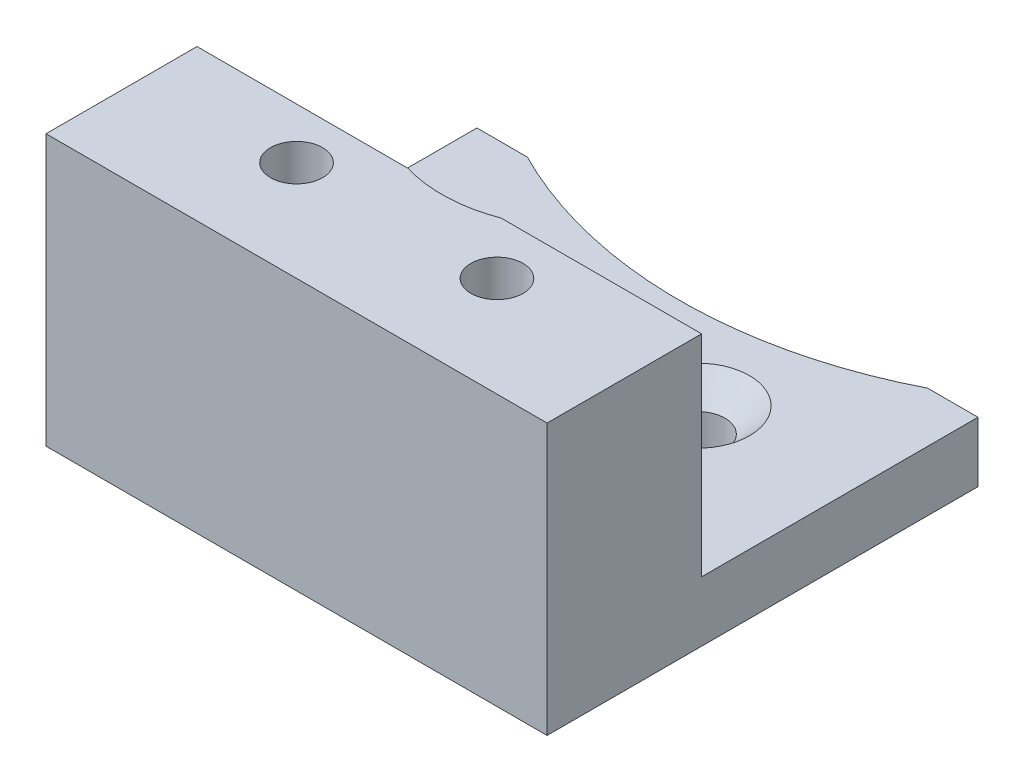
ISO-10303-21;
HEADER;
FILE_DESCRIPTION(('STEP AP214'),'2;1');
FILE_NAME('part.step','',(''),(''),'','','');
FILE_SCHEMA(('AUTOMOTIVE_DESIGN { 1 0 10303 214 1 1 1 1 }'));
ENDSEC;
DATA;
#1=APPLICATION_CONTEXT('core data for automotive mechanical design processes');
#2=APPLICATION_PROTOCOL_DEFINITION('international standard','automotive_design',2000,#1);
#3=PRODUCT_CONTEXT('',#1,'mechanical');
#4=PRODUCT('Part','Part','',(#3));
#5=PRODUCT_RELATED_PRODUCT_CATEGORY('part','',(#4));
#6=PRODUCT_DEFINITION_FORMATION('','',#4);
#7=PRODUCT_DEFINITION_CONTEXT('part definition',#1,'design');
#8=PRODUCT_DEFINITION('design','',#6,#7);
#9=PRODUCT_DEFINITION_SHAPE('','',#8);
#10=(LENGTH_UNIT() NAMED_UNIT(*) SI_UNIT(.MILLI.,.METRE.));
#11=(NAMED_UNIT(*) PLANE_ANGLE_UNIT() SI_UNIT($,.RADIAN.));
#12=(NAMED_UNIT(*) SI_UNIT($,.STERADIAN.) SOLID_ANGLE_UNIT());
#13=UNCERTAINTY_MEASURE_WITH_UNIT(LENGTH_MEASURE(1.E-05),#10,'distance_accuracy_value','');
#14=(GEOMETRIC_REPRESENTATION_CONTEXT(3) GLOBAL_UNCERTAINTY_ASSIGNED_CONTEXT((#13)) GLOBAL_UNIT_ASSIGNED_CONTEXT((#10,
#11,#12)) REPRESENTATION_CONTEXT('',''));
#15=CARTESIAN_POINT('',(0.,0.,0.));
#16=DIRECTION('',(0.,0.,1.));
#17=DIRECTION('',(1.,0.,0.));
#18=AXIS2_PLACEMENT_3D('',#15,#16,#17);
#19=CARTESIAN_POINT('',(0.,6.,0.));
#20=DIRECTION('',(0.,1.,0.));
#21=DIRECTION('',(0.,0.,1.));
#22=AXIS2_PLACEMENT_3D('',#19,#20,#21);
#23=PLANE('',#22);
#24=CARTESIAN_POINT('',(25.,6.,17.5));
#25=DIRECTION('',(0.,1.,0.));
#26=DIRECTION('',(0.,0.,1.));
#27=AXIS2_PLACEMENT_3D('',#24,#25,#26);
#28=CIRCLE('',#27,3.25);
#29=CARTESIAN_POINT('',(25.,6.,20.75));
#30=VERTEX_POINT('',#29);
#31=EDGE_CURVE('E189',#30,#30,#28,.T.);
#32=ORIENTED_EDGE('',*,*,#31,.F.);
#33=EDGE_LOOP('',(#32));
#34=FACE_BOUND('',#33,.T.);
#35=CARTESIAN_POINT('',(35.,6.,16.));
#36=DIRECTION('',(0.,1.,0.));
#37=DIRECTION('',(0.,0.,1.));
#38=AXIS2_PLACEMENT_3D('',#35,#36,#37);
#39=CIRCLE('',#38,5.2);
#40=CARTESIAN_POINT('',(35.,6.,21.2));
#41=VERTEX_POINT('',#40);
#42=EDGE_CURVE('E178',#41,#41,#39,.T.);
#43=ORIENTED_EDGE('',*,*,#42,.F.);
#44=EDGE_LOOP('',(#43));
#45=FACE_BOUND('',#44,.T.);
#46=CARTESIAN_POINT('',(15.,6.,16.));
#47=DIRECTION('',(0.,1.,0.));
#48=DIRECTION('',(0.,0.,1.));
#49=AXIS2_PLACEMENT_3D('',#46,#47,#48);
#50=CIRCLE('',#49,5.2);
#51=CARTESIAN_POINT('',(15.,6.,21.2));
#52=VERTEX_POINT('',#51);
#53=EDGE_CURVE('E169',#52,#52,#50,.T.);
#54=ORIENTED_EDGE('',*,*,#53,.F.);
#55=EDGE_LOOP('',(#54));
#56=FACE_BOUND('',#55,.T.);
#57=CARTESIAN_POINT('',(25.,6.,17.5));
#58=DIRECTION('',(0.,-1.,0.));
#59=DIRECTION('',(0.,0.,1.));
#60=AXIS2_PLACEMENT_3D('',#57,#58,#59);
#61=CIRCLE('',#60,14.);
#62=CARTESIAN_POINT('',(29.9890512919729,6.,30.5808779218393));
#63=VERTEX_POINT('',#62);
#64=CARTESIAN_POINT('',(21.0399484474264,6.,30.9282534866214));
#65=VERTEX_POINT('',#64);
#66=EDGE_CURVE('E146',#63,#65,#61,.T.);
#67=ORIENTED_EDGE('',*,*,#66,.F.);
#68=DIRECTION('',(-1.,0.,0.));
#69=VECTOR('',#68,1.);
#70=CARTESIAN_POINT('',(50.,6.,30.5808779218393));
#71=LINE('',#70,#69);
#72=CARTESIAN_POINT('',(50.,6.,30.5808779218393));
#73=VERTEX_POINT('',#72);
#74=EDGE_CURVE('E159',#73,#63,#71,.T.);
#75=ORIENTED_EDGE('',*,*,#74,.F.);
#76=DIRECTION('',(0.,0.,1.));
#77=VECTOR('',#76,1.);
#78=CARTESIAN_POINT('',(50.,6.,0.));
#79=LINE('',#78,#77);
#80=CARTESIAN_POINT('',(50.,6.,3.));
#81=VERTEX_POINT('',#80);
#82=EDGE_CURVE('E206',#81,#73,#79,.T.);
#83=ORIENTED_EDGE('',*,*,#82,.F.);
#84=DIRECTION('',(1.,0.,0.));
#85=VECTOR('',#84,1.);
#86=CARTESIAN_POINT('',(0.,6.,3.00000000000003));
#87=LINE('',#86,#85);
#88=CARTESIAN_POINT('',(44.9688155912468,6.,3.));
#89=VERTEX_POINT('',#88);
#90=EDGE_CURVE('E209',#89,#81,#87,.T.);
#91=ORIENTED_EDGE('',*,*,#90,.F.);
#92=CARTESIAN_POINT('',(25.,6.,-36.2077339804633));
#93=DIRECTION('',(0.,1.,0.));
#94=DIRECTION('',(0.,0.,1.));
#95=AXIS2_PLACEMENT_3D('',#92,#93,#94);
#96=CIRCLE('',#95,44.);
#97=CARTESIAN_POINT('',(5.03118440875324,6.,3.));
#98=VERTEX_POINT('',#97);
#99=EDGE_CURVE('E197',#98,#89,#96,.T.);
#100=ORIENTED_EDGE('',*,*,#99,.F.);
#101=DIRECTION('',(1.,0.,0.));
#102=VECTOR('',#101,1.);
#103=CARTESIAN_POINT('',(0.,6.,3.));
#104=LINE('',#103,#102);
#105=CARTESIAN_POINT('',(0.,6.,3.));
#106=VERTEX_POINT('',#105);
#107=EDGE_CURVE('E199',#106,#98,#104,.T.);
#108=ORIENTED_EDGE('',*,*,#107,.F.);
#109=DIRECTION('',(0.,0.,1.));
#110=VECTOR('',#109,1.);
#111=CARTESIAN_POINT('',(0.,6.,0.));
#112=LINE('',#111,#110);
#113=CARTESIAN_POINT('',(0.,6.,30.9282534866214));
#114=VERTEX_POINT('',#113);
#115=EDGE_CURVE('E203',#106,#114,#112,.T.);
#116=ORIENTED_EDGE('',*,*,#115,.T.);
#117=DIRECTION('',(-1.,0.,0.));
#118=VECTOR('',#117,1.);
#119=CARTESIAN_POINT('',(21.0399484474264,6.,30.9282534866214));
#120=LINE('',#119,#118);
#121=EDGE_CURVE('E144',#65,#114,#120,.T.);
#122=ORIENTED_EDGE('',*,*,#121,.F.);
#123=EDGE_LOOP('',(#67,#75,#83,#91,#100,#108,#116,#122));
#124=FACE_BOUND('',#123,.T.);
#125=ADVANCED_FACE('F35',(#34,#45,#56,#124),#23,.T.);
#126=CARTESIAN_POINT('',(25.,6.,-36.2077339804633));
#127=DIRECTION('',(0.,-1.,0.));
#128=DIRECTION('',(0.,0.,-1.));
#129=AXIS2_PLACEMENT_3D('',#126,#127,#128);
#130=CYLINDRICAL_SURFACE('',#129,44.);
#131=CARTESIAN_POINT('',(25.,0.,-36.2077339804633));
#132=DIRECTION('',(0.,1.,0.));
#133=DIRECTION('',(0.,0.,1.));
#134=AXIS2_PLACEMENT_3D('',#131,#132,#133);
#135=CIRCLE('',#134,44.);
#136=CARTESIAN_POINT('',(5.03118440875324,0.,3.));
#137=VERTEX_POINT('',#136);
#138=CARTESIAN_POINT('',(44.9688155912468,0.,3.));
#139=VERTEX_POINT('',#138);
#140=EDGE_CURVE('E194',#137,#139,#135,.T.);
#141=ORIENTED_EDGE('',*,*,#140,.F.);
#142=DIRECTION('',(0.,-1.,0.));
#143=VECTOR('',#142,1.);
#144=CARTESIAN_POINT('',(5.03118440875324,6.,3.));
#145=LINE('',#144,#143);
#146=EDGE_CURVE('E39',#98,#137,#145,.T.);
#147=ORIENTED_EDGE('',*,*,#146,.F.);
#148=ORIENTED_EDGE('',*,*,#99,.T.);
#149=DIRECTION('',(0.,-1.,0.));
#150=VECTOR('',#149,1.);
#151=CARTESIAN_POINT('',(44.9688155912468,6.,3.));
#152=LINE('',#151,#150);
#153=EDGE_CURVE('E60',#89,#139,#152,.T.);
#154=ORIENTED_EDGE('',*,*,#153,.T.);
#155=EDGE_LOOP('',(#141,#147,#148,#154));
#156=FACE_BOUND('',#155,.T.);
#157=ADVANCED_FACE('F37',(#156),#130,.F.);
#158=CARTESIAN_POINT('',(0.,6.,3.));
#159=DIRECTION('',(0.,0.,-1.));
#160=DIRECTION('',(-1.,0.,0.));
#161=AXIS2_PLACEMENT_3D('',#158,#159,#160);
#162=PLANE('',#161);
#163=DIRECTION('',(1.,0.,0.));
#164=VECTOR('',#163,1.);
#165=CARTESIAN_POINT('',(0.,0.,3.));
#166=LINE('',#165,#164);
#167=CARTESIAN_POINT('',(0.,0.,3.));
#168=VERTEX_POINT('',#167);
#169=EDGE_CURVE('E212',#168,#137,#166,.T.);
#170=ORIENTED_EDGE('',*,*,#169,.F.);
#171=DIRECTION('',(0.,-1.,0.));
#172=VECTOR('',#171,1.);
#173=CARTESIAN_POINT('',(0.,6.,3.));
#174=LINE('',#173,#172);
#175=EDGE_CURVE('E130',#106,#168,#174,.T.);
#176=ORIENTED_EDGE('',*,*,#175,.F.);
#177=ORIENTED_EDGE('',*,*,#107,.T.);
#178=ORIENTED_EDGE('',*,*,#146,.T.);
#179=EDGE_LOOP('',(#170,#176,#177,#178));
#180=FACE_BOUND('',#179,.T.);
#181=ADVANCED_FACE('F235',(#180),#162,.T.);
#182=CARTESIAN_POINT('',(0.,6.,0.));
#183=DIRECTION('',(1.,0.,0.));
#184=DIRECTION('',(0.,0.,-1.));
#185=AXIS2_PLACEMENT_3D('',#182,#183,#184);
#186=PLANE('',#185);
#187=DIRECTION('',(0.,0.,1.));
#188=VECTOR('',#187,1.);
#189=CARTESIAN_POINT('',(0.,0.,0.));
#190=LINE('',#189,#188);
#191=CARTESIAN_POINT('',(0.,0.,46.));
#192=VERTEX_POINT('',#191);
#193=EDGE_CURVE('E126',#168,#192,#190,.T.);
#194=ORIENTED_EDGE('',*,*,#193,.T.);
#195=DIRECTION('',(0.,-1.,0.));
#196=VECTOR('',#195,1.);
#197=CARTESIAN_POINT('',(0.,6.,46.));
#198=LINE('',#197,#196);
#199=CARTESIAN_POINT('',(0.,27.,46.));
#200=VERTEX_POINT('',#199);
#201=EDGE_CURVE('E119',#200,#192,#198,.T.);
#202=ORIENTED_EDGE('',*,*,#201,.F.);
#203=DIRECTION('',(0.,0.,1.));
#204=VECTOR('',#203,1.);
#205=CARTESIAN_POINT('',(0.,27.,30.9282534866214));
#206=LINE('',#205,#204);
#207=CARTESIAN_POINT('',(0.,27.,30.9282534866214));
#208=VERTEX_POINT('',#207);
#209=EDGE_CURVE('E124',#208,#200,#206,.T.);
#210=ORIENTED_EDGE('',*,*,#209,.F.);
#211=DIRECTION('',(0.,-1.,0.));
#212=VECTOR('',#211,1.);
#213=CARTESIAN_POINT('',(0.,27.,30.9282534866214));
#214=LINE('',#213,#212);
#215=EDGE_CURVE('E158',#208,#114,#214,.T.);
#216=ORIENTED_EDGE('',*,*,#215,.T.);
#217=ORIENTED_EDGE('',*,*,#115,.F.);
#218=ORIENTED_EDGE('',*,*,#175,.T.);
#219=EDGE_LOOP('',(#194,#202,#210,#216,#217,#218));
#220=FACE_BOUND('',#219,.T.);
#221=ADVANCED_FACE('F121',(#220),#186,.F.);
#222=CARTESIAN_POINT('',(0.,6.,46.));
#223=DIRECTION('',(0.,0.,-1.));
#224=DIRECTION('',(-1.,0.,0.));
#225=AXIS2_PLACEMENT_3D('',#222,#223,#224);
#226=PLANE('',#225);
#227=DIRECTION('',(1.,0.,0.));
#228=VECTOR('',#227,1.);
#229=CARTESIAN_POINT('',(0.,0.,46.));
#230=LINE('',#229,#228);
#231=CARTESIAN_POINT('',(50.,0.,46.));
#232=VERTEX_POINT('',#231);
#233=EDGE_CURVE('E216',#192,#232,#230,.T.);
#234=ORIENTED_EDGE('',*,*,#233,.T.);
#235=DIRECTION('',(0.,-1.,0.));
#236=VECTOR('',#235,1.);
#237=CARTESIAN_POINT('',(50.,6.,46.));
#238=LINE('',#237,#236);
#239=CARTESIAN_POINT('',(50.,27.,46.));
#240=VERTEX_POINT('',#239);
#241=EDGE_CURVE('E131',#240,#232,#238,.T.);
#242=ORIENTED_EDGE('',*,*,#241,.F.);
#243=DIRECTION('',(1.,0.,0.));
#244=VECTOR('',#243,1.);
#245=CARTESIAN_POINT('',(0.,27.,46.));
#246=LINE('',#245,#244);
#247=EDGE_CURVE('E134',#200,#240,#246,.T.);
#248=ORIENTED_EDGE('',*,*,#247,.F.);
#249=ORIENTED_EDGE('',*,*,#201,.T.);
#250=EDGE_LOOP('',(#234,#242,#248,#249));
#251=FACE_BOUND('',#250,.T.);
#252=ADVANCED_FACE('F135',(#251),#226,.F.);
#253=CARTESIAN_POINT('',(50.,6.,0.));
#254=DIRECTION('',(1.,0.,0.));
#255=DIRECTION('',(0.,0.,-1.));
#256=AXIS2_PLACEMENT_3D('',#253,#254,#255);
#257=PLANE('',#256);
#258=DIRECTION('',(0.,0.,1.));
#259=VECTOR('',#258,1.);
#260=CARTESIAN_POINT('',(50.,0.,0.));
#261=LINE('',#260,#259);
#262=CARTESIAN_POINT('',(50.,0.,3.));
#263=VERTEX_POINT('',#262);
#264=EDGE_CURVE('E218',#263,#232,#261,.T.);
#265=ORIENTED_EDGE('',*,*,#264,.F.);
#266=DIRECTION('',(0.,-1.,0.));
#267=VECTOR('',#266,1.);
#268=CARTESIAN_POINT('',(50.,6.,3.));
#269=LINE('',#268,#267);
#270=EDGE_CURVE('E230',#81,#263,#269,.T.);
#271=ORIENTED_EDGE('',*,*,#270,.F.);
#272=ORIENTED_EDGE('',*,*,#82,.T.);
#273=DIRECTION('',(0.,-1.,0.));
#274=VECTOR('',#273,1.);
#275=CARTESIAN_POINT('',(50.,27.,30.5808779218393));
#276=LINE('',#275,#274);
#277=CARTESIAN_POINT('',(50.,27.,30.5808779218393));
#278=VERTEX_POINT('',#277);
#279=EDGE_CURVE('E167',#278,#73,#276,.T.);
#280=ORIENTED_EDGE('',*,*,#279,.F.);
#281=DIRECTION('',(0.,0.,-1.));
#282=VECTOR('',#281,1.);
#283=CARTESIAN_POINT('',(50.,27.,46.));
#284=LINE('',#283,#282);
#285=EDGE_CURVE('E138',#240,#278,#284,.T.);
#286=ORIENTED_EDGE('',*,*,#285,.F.);
#287=ORIENTED_EDGE('',*,*,#241,.T.);
#288=EDGE_LOOP('',(#265,#271,#272,#280,#286,#287));
#289=FACE_BOUND('',#288,.T.);
#290=ADVANCED_FACE('F242',(#289),#257,.T.);
#291=CARTESIAN_POINT('',(35.,6.,36.));
#292=DIRECTION('',(0.,-1.,0.));
#293=DIRECTION('',(0.,0.,-1.));
#294=AXIS2_PLACEMENT_3D('',#291,#292,#293);
#295=CYLINDRICAL_SURFACE('',#294,2.6);
#296=CARTESIAN_POINT('',(35.,0.,36.));
#297=DIRECTION('',(0.,1.,0.));
#298=DIRECTION('',(0.,0.,1.));
#299=AXIS2_PLACEMENT_3D('',#296,#297,#298);
#300=CIRCLE('',#299,2.6);
#301=CARTESIAN_POINT('',(35.,0.,38.6));
#302=VERTEX_POINT('',#301);
#303=EDGE_CURVE('E200',#302,#302,#300,.T.);
#304=ORIENTED_EDGE('',*,*,#303,.F.);
#305=EDGE_LOOP('',(#304));
#306=FACE_BOUND('',#305,.T.);
#307=CARTESIAN_POINT('',(35.,27.,36.));
#308=DIRECTION('',(0.,1.,0.));
#309=DIRECTION('',(0.,0.,1.));
#310=AXIS2_PLACEMENT_3D('',#307,#308,#309);
#311=CIRCLE('',#310,2.6);
#312=CARTESIAN_POINT('',(35.,27.,38.6));
#313=VERTEX_POINT('',#312);
#314=EDGE_CURVE('E293',#313,#313,#311,.T.);
#315=ORIENTED_EDGE('',*,*,#314,.T.);
#316=EDGE_LOOP('',(#315));
#317=FACE_BOUND('',#316,.T.);
#318=ADVANCED_FACE('F269',(#306,#317),#295,.F.);
#319=CARTESIAN_POINT('',(15.,6.,36.));
#320=DIRECTION('',(0.,-1.,0.));
#321=DIRECTION('',(0.,0.,-1.));
#322=AXIS2_PLACEMENT_3D('',#319,#320,#321);
#323=CYLINDRICAL_SURFACE('',#322,2.6);
#324=CARTESIAN_POINT('',(15.,0.,36.));
#325=DIRECTION('',(0.,1.,0.));
#326=DIRECTION('',(0.,0.,1.));
#327=AXIS2_PLACEMENT_3D('',#324,#325,#326);
#328=CIRCLE('',#327,2.6);
#329=CARTESIAN_POINT('',(15.,0.,38.6));
#330=VERTEX_POINT('',#329);
#331=EDGE_CURVE('E224',#330,#330,#328,.T.);
#332=ORIENTED_EDGE('',*,*,#331,.F.);
#333=EDGE_LOOP('',(#332));
#334=FACE_BOUND('',#333,.T.);
#335=CARTESIAN_POINT('',(15.,27.,36.));
#336=DIRECTION('',(0.,1.,0.));
#337=DIRECTION('',(0.,0.,1.));
#338=AXIS2_PLACEMENT_3D('',#335,#336,#337);
#339=CIRCLE('',#338,2.6);
#340=CARTESIAN_POINT('',(15.,27.,38.6));
#341=VERTEX_POINT('',#340);
#342=EDGE_CURVE('E149',#341,#341,#339,.T.);
#343=ORIENTED_EDGE('',*,*,#342,.T.);
#344=EDGE_LOOP('',(#343));
#345=FACE_BOUND('',#344,.T.);
#346=ADVANCED_FACE('F260',(#334,#345),#323,.F.);
#347=CARTESIAN_POINT('',(0.,6.,3.00000000000003));
#348=DIRECTION('',(0.,0.,-1.));
#349=DIRECTION('',(-1.,0.,0.));
#350=AXIS2_PLACEMENT_3D('',#347,#348,#349);
#351=PLANE('',#350);
#352=DIRECTION('',(1.,0.,0.));
#353=VECTOR('',#352,1.);
#354=CARTESIAN_POINT('',(0.,0.,3.00000000000003));
#355=LINE('',#354,#353);
#356=EDGE_CURVE('E221',#139,#263,#355,.T.);
#357=ORIENTED_EDGE('',*,*,#356,.F.);
#358=ORIENTED_EDGE('',*,*,#153,.F.);
#359=ORIENTED_EDGE('',*,*,#90,.T.);
#360=ORIENTED_EDGE('',*,*,#270,.T.);
#361=EDGE_LOOP('',(#357,#358,#359,#360));
#362=FACE_BOUND('',#361,.T.);
#363=ADVANCED_FACE('F258',(#362),#351,.T.);
#364=CARTESIAN_POINT('',(0.,0.,0.));
#365=DIRECTION('',(0.,1.,0.));
#366=DIRECTION('',(0.,0.,1.));
#367=AXIS2_PLACEMENT_3D('',#364,#365,#366);
#368=PLANE('',#367);
#369=CARTESIAN_POINT('',(15.,0.,16.));
#370=DIRECTION('',(0.,1.,0.));
#371=DIRECTION('',(0.,0.,1.));
#372=AXIS2_PLACEMENT_3D('',#369,#370,#371);
#373=CIRCLE('',#372,2.75);
#374=CARTESIAN_POINT('',(15.,0.,18.75));
#375=VERTEX_POINT('',#374);
#376=EDGE_CURVE('E175',#375,#375,#373,.T.);
#377=ORIENTED_EDGE('',*,*,#376,.T.);
#378=EDGE_LOOP('',(#377));
#379=FACE_BOUND('',#378,.T.);
#380=CARTESIAN_POINT('',(35.,0.,16.));
#381=DIRECTION('',(0.,1.,0.));
#382=DIRECTION('',(0.,0.,1.));
#383=AXIS2_PLACEMENT_3D('',#380,#381,#382);
#384=CIRCLE('',#383,2.75);
#385=CARTESIAN_POINT('',(35.,0.,18.75));
#386=VERTEX_POINT('',#385);
#387=EDGE_CURVE('E184',#386,#386,#384,.T.);
#388=ORIENTED_EDGE('',*,*,#387,.T.);
#389=EDGE_LOOP('',(#388));
#390=FACE_BOUND('',#389,.T.);
#391=ORIENTED_EDGE('',*,*,#140,.T.);
#392=ORIENTED_EDGE('',*,*,#356,.T.);
#393=ORIENTED_EDGE('',*,*,#264,.T.);
#394=ORIENTED_EDGE('',*,*,#233,.F.);
#395=ORIENTED_EDGE('',*,*,#193,.F.);
#396=ORIENTED_EDGE('',*,*,#169,.T.);
#397=EDGE_LOOP('',(#391,#392,#393,#394,#395,#396));
#398=FACE_BOUND('',#397,.T.);
#399=ORIENTED_EDGE('',*,*,#331,.T.);
#400=EDGE_LOOP('',(#399));
#401=FACE_BOUND('',#400,.T.);
#402=ORIENTED_EDGE('',*,*,#303,.T.);
#403=EDGE_LOOP('',(#402));
#404=FACE_BOUND('',#403,.T.);
#405=ADVANCED_FACE('F238',(#379,#390,#398,#401,#404),#368,.F.);
#406=CARTESIAN_POINT('',(25.,8.,17.5));
#407=DIRECTION('',(0.,-1.,0.));
#408=DIRECTION('',(0.,0.,-1.));
#409=AXIS2_PLACEMENT_3D('',#406,#407,#408);
#410=CYLINDRICAL_SURFACE('',#409,3.25);
#411=CARTESIAN_POINT('',(25.,8.,17.5));
#412=DIRECTION('',(0.,1.,0.));
#413=DIRECTION('',(0.,0.,1.));
#414=AXIS2_PLACEMENT_3D('',#411,#412,#413);
#415=CIRCLE('',#414,3.25);
#416=CARTESIAN_POINT('',(25.,8.,20.75));
#417=VERTEX_POINT('',#416);
#418=EDGE_CURVE('E191',#417,#417,#415,.T.);
#419=ORIENTED_EDGE('',*,*,#418,.F.);
#420=EDGE_LOOP('',(#419));
#421=FACE_BOUND('',#420,.T.);
#422=ORIENTED_EDGE('',*,*,#31,.T.);
#423=EDGE_LOOP('',(#422));
#424=FACE_BOUND('',#423,.T.);
#425=ADVANCED_FACE('F266',(#421,#424),#410,.T.);
#426=CARTESIAN_POINT('',(25.,8.,17.5));
#427=DIRECTION('',(0.,1.,0.));
#428=DIRECTION('',(0.,0.,1.));
#429=AXIS2_PLACEMENT_3D('',#426,#427,#428);
#430=PLANE('',#429);
#431=CARTESIAN_POINT('',(25.,8.,17.5));
#432=DIRECTION('',(0.,1.,0.));
#433=DIRECTION('',(0.,0.,1.));
#434=AXIS2_PLACEMENT_3D('',#431,#432,#433);
#435=CIRCLE('',#434,2.5);
#436=CARTESIAN_POINT('',(25.,8.,15.));
#437=VERTEX_POINT('',#436);
#438=EDGE_CURVE('E11',#437,#437,#435,.T.);
#439=ORIENTED_EDGE('',*,*,#438,.F.);
#440=EDGE_LOOP('',(#439));
#441=FACE_BOUND('',#440,.T.);
#442=ORIENTED_EDGE('',*,*,#418,.T.);
#443=EDGE_LOOP('',(#442));
#444=FACE_BOUND('',#443,.T.);
#445=ADVANCED_FACE('F331',(#441,#444),#430,.T.);
#446=CARTESIAN_POINT('',(25.,10.7,17.5));
#447=DIRECTION('',(0.,-1.,0.));
#448=DIRECTION('',(0.,0.,-1.));
#449=AXIS2_PLACEMENT_3D('',#446,#447,#448);
#450=CYLINDRICAL_SURFACE('',#449,2.5);
#451=CARTESIAN_POINT('',(25.,10.7,17.5));
#452=DIRECTION('',(0.,1.,0.));
#453=DIRECTION('',(0.,0.,1.));
#454=AXIS2_PLACEMENT_3D('',#451,#452,#453);
#455=CIRCLE('',#454,2.5);
#456=CARTESIAN_POINT('',(25.,10.7,15.));
#457=VERTEX_POINT('',#456);
#458=EDGE_CURVE('E187',#457,#457,#455,.T.);
#459=CARTESIAN_POINT('',(25.,10.7,15.));
#460=CARTESIAN_POINT('',(25.,10.671875,15.));
#461=CARTESIAN_POINT('',(25.,10.64375,15.));
#462=CARTESIAN_POINT('',(25.,10.5875,15.));
#463=CARTESIAN_POINT('',(25.,10.559375,15.));
#464=CARTESIAN_POINT('',(25.,10.503125,15.));
#465=CARTESIAN_POINT('',(25.,10.475,15.));
#466=CARTESIAN_POINT('',(25.,10.41875,15.));
#467=CARTESIAN_POINT('',(25.,10.390625,15.));
#468=CARTESIAN_POINT('',(25.,10.334375,15.));
#469=CARTESIAN_POINT('',(25.,10.30625,15.));
#470=CARTESIAN_POINT('',(25.,10.25,15.));
#471=CARTESIAN_POINT('',(25.,10.221875,15.));
#472=CARTESIAN_POINT('',(25.,10.165625,15.));
#473=CARTESIAN_POINT('',(25.,10.1375,15.));
#474=CARTESIAN_POINT('',(25.,10.08125,15.));
#475=CARTESIAN_POINT('',(25.,10.053125,15.));
#476=CARTESIAN_POINT('',(25.,9.996875,15.));
#477=CARTESIAN_POINT('',(25.,9.96875,15.));
#478=CARTESIAN_POINT('',(25.,9.9125,15.));
#479=CARTESIAN_POINT('',(25.,9.884375,15.));
#480=CARTESIAN_POINT('',(25.,9.828125,15.));
#481=CARTESIAN_POINT('',(25.,9.8,15.));
#482=CARTESIAN_POINT('',(25.,9.74375,15.));
#483=CARTESIAN_POINT('',(25.,9.715625,15.));
#484=CARTESIAN_POINT('',(25.,9.659375,15.));
#485=CARTESIAN_POINT('',(25.,9.63125,15.));
#486=CARTESIAN_POINT('',(25.,9.575,15.));
#487=CARTESIAN_POINT('',(25.,9.546875,15.));
#488=CARTESIAN_POINT('',(25.,9.490625,15.));
#489=CARTESIAN_POINT('',(25.,9.4625,15.));
#490=CARTESIAN_POINT('',(25.,9.40625,15.));
#491=CARTESIAN_POINT('',(25.,9.378125,15.));
#492=CARTESIAN_POINT('',(25.,9.321875,15.));
#493=CARTESIAN_POINT('',(25.,9.29375,15.));
#494=CARTESIAN_POINT('',(25.,9.2375,15.));
#495=CARTESIAN_POINT('',(25.,9.209375,15.));
#496=CARTESIAN_POINT('',(25.,9.153125,15.));
#497=CARTESIAN_POINT('',(25.,9.125,15.));
#498=CARTESIAN_POINT('',(25.,9.06875,15.));
#499=CARTESIAN_POINT('',(25.,9.040625,15.));
#500=CARTESIAN_POINT('',(25.,8.984375,15.));
#501=CARTESIAN_POINT('',(25.,8.95625,15.));
#502=CARTESIAN_POINT('',(25.,8.9,15.));
#503=CARTESIAN_POINT('',(25.,8.871875,15.));
#504=CARTESIAN_POINT('',(25.,8.815625,15.));
#505=CARTESIAN_POINT('',(25.,8.7875,15.));
#506=CARTESIAN_POINT('',(25.,8.73125,15.));
#507=CARTESIAN_POINT('',(25.,8.703125,15.));
#508=CARTESIAN_POINT('',(25.,8.646875,15.));
#509=CARTESIAN_POINT('',(25.,8.61875,15.));
#510=CARTESIAN_POINT('',(25.,8.5625,15.));
#511=CARTESIAN_POINT('',(25.,8.534375,15.));
#512=CARTESIAN_POINT('',(25.,8.478125,15.));
#513=CARTESIAN_POINT('',(25.,8.45,15.));
#514=CARTESIAN_POINT('',(25.,8.39375,15.));
#515=CARTESIAN_POINT('',(25.,8.365625,15.));
#516=CARTESIAN_POINT('',(25.,8.309375,15.));
#517=CARTESIAN_POINT('',(25.,8.28125,15.));
#518=CARTESIAN_POINT('',(25.,8.225,15.));
#519=CARTESIAN_POINT('',(25.,8.196875,15.));
#520=CARTESIAN_POINT('',(25.,8.140625,15.));
#521=CARTESIAN_POINT('',(25.,8.1125,15.));
#522=CARTESIAN_POINT('',(25.,8.05625,15.));
#523=CARTESIAN_POINT('',(25.,8.028125,15.));
#524=CARTESIAN_POINT('',(25.,8.,15.));
#525=B_SPLINE_CURVE_WITH_KNOTS('',3,(#459,#460,#461,#462,#463,#464,#465,#466,#467,#468,#469,
#470,#471,#472,#473,#474,#475,#476,#477,#478,#479,#480,#481,#482,#483,#484,#485,#486,#487,#488,
#489,#490,#491,#492,#493,#494,#495,#496,#497,#498,#499,#500,#501,#502,#503,#504,#505,#506,#507,
#508,#509,#510,#511,#512,#513,#514,#515,#516,#517,#518,#519,#520,#521,#522,#523,#524),
.UNSPECIFIED.,.F.,.F.,(4,2,2,2,2,2,2,2,2,2,2,2,2,2,2,2,2,2,2,2,2,2,2,2,2,2,2,2,2,2,2,2,4),(0.,
0.0843749999999994,0.168749999999999,0.253125,0.337499999999999,0.421874999999999,0.50625,
0.590624999999999,0.675,0.759375,0.843749999999999,0.928125,1.0125,1.096875,1.18125,1.265625,
1.35,1.434375,1.51875,1.603125,1.6875,1.771875,1.85625,1.940625,2.025,2.109375,2.19375,2.278125,
2.3625,2.446875,2.53125,2.615625,2.7),.UNSPECIFIED.);
#526=EDGE_CURVE('BSEAM328',#457,#437,#525,.T.);
#527=ORIENTED_EDGE('',*,*,#458,.F.);
#528=ORIENTED_EDGE('',*,*,#438,.T.);
#529=ORIENTED_EDGE('',*,*,#526,.T.);
#530=ORIENTED_EDGE('',*,*,#526,.F.);
#531=EDGE_LOOP('',(#527,#529,#528,#530));
#532=FACE_BOUND('',#531,.T.);
#533=ADVANCED_FACE('F328',(#532),#450,.T.);
#534=CARTESIAN_POINT('',(25.,10.7,17.5));
#535=DIRECTION('',(0.,1.,0.));
#536=DIRECTION('',(0.,0.,1.));
#537=AXIS2_PLACEMENT_3D('',#534,#535,#536);
#538=PLANE('',#537);
#539=ORIENTED_EDGE('',*,*,#458,.T.);
#540=EDGE_LOOP('',(#539));
#541=FACE_BOUND('',#540,.T.);
#542=ADVANCED_FACE('F324',(#541),#538,.T.);
#543=CARTESIAN_POINT('',(35.,6.,16.));
#544=DIRECTION('',(0.,1.,0.));
#545=DIRECTION('',(0.,0.,1.));
#546=AXIS2_PLACEMENT_3D('',#543,#544,#545);
#547=CYLINDRICAL_SURFACE('',#546,2.75);
#548=ORIENTED_EDGE('',*,*,#387,.F.);
#549=EDGE_LOOP('',(#548));
#550=FACE_BOUND('',#549,.T.);
#551=CARTESIAN_POINT('',(35.,3.55,16.));
#552=DIRECTION('',(0.,1.,0.));
#553=DIRECTION('',(0.,0.,1.));
#554=AXIS2_PLACEMENT_3D('',#551,#552,#553);
#555=CIRCLE('',#554,2.75);
#556=CARTESIAN_POINT('',(35.,3.55,18.75));
#557=VERTEX_POINT('',#556);
#558=EDGE_CURVE('E181',#557,#557,#555,.T.);
#559=ORIENTED_EDGE('',*,*,#558,.T.);
#560=EDGE_LOOP('',(#559));
#561=FACE_BOUND('',#560,.T.);
#562=ADVANCED_FACE('F320',(#550,#561),#547,.F.);
#563=CARTESIAN_POINT('',(35.,6.,16.));
#564=DIRECTION('',(0.,1.,0.));
#565=DIRECTION('',(0.,0.,1.));
#566=AXIS2_PLACEMENT_3D('',#563,#564,#565);
#567=CONICAL_SURFACE('',#566,5.2,0.785398163397449);
#568=ORIENTED_EDGE('',*,*,#558,.F.);
#569=EDGE_LOOP('',(#568));
#570=FACE_BOUND('',#569,.T.);
#571=ORIENTED_EDGE('',*,*,#42,.T.);
#572=EDGE_LOOP('',(#571));
#573=FACE_BOUND('',#572,.T.);
#574=ADVANCED_FACE('F316',(#570,#573),#567,.F.);
#575=CARTESIAN_POINT('',(15.,6.,16.));
#576=DIRECTION('',(0.,1.,0.));
#577=DIRECTION('',(0.,0.,1.));
#578=AXIS2_PLACEMENT_3D('',#575,#576,#577);
#579=CYLINDRICAL_SURFACE('',#578,2.75);
#580=ORIENTED_EDGE('',*,*,#376,.F.);
#581=EDGE_LOOP('',(#580));
#582=FACE_BOUND('',#581,.T.);
#583=CARTESIAN_POINT('',(15.,3.55,16.));
#584=DIRECTION('',(0.,1.,0.));
#585=DIRECTION('',(0.,0.,1.));
#586=AXIS2_PLACEMENT_3D('',#583,#584,#585);
#587=CIRCLE('',#586,2.75);
#588=CARTESIAN_POINT('',(15.,3.55,18.75));
#589=VERTEX_POINT('',#588);
#590=EDGE_CURVE('E172',#589,#589,#587,.T.);
#591=ORIENTED_EDGE('',*,*,#590,.T.);
#592=EDGE_LOOP('',(#591));
#593=FACE_BOUND('',#592,.T.);
#594=ADVANCED_FACE('F306',(#582,#593),#579,.F.);
#595=CARTESIAN_POINT('',(15.,6.,16.));
#596=DIRECTION('',(0.,1.,0.));
#597=DIRECTION('',(0.,0.,1.));
#598=AXIS2_PLACEMENT_3D('',#595,#596,#597);
#599=CONICAL_SURFACE('',#598,5.2,0.785398163397449);
#600=ORIENTED_EDGE('',*,*,#590,.F.);
#601=EDGE_LOOP('',(#600));
#602=FACE_BOUND('',#601,.T.);
#603=ORIENTED_EDGE('',*,*,#53,.T.);
#604=EDGE_LOOP('',(#603));
#605=FACE_BOUND('',#604,.T.);
#606=ADVANCED_FACE('F299',(#602,#605),#599,.F.);
#607=CARTESIAN_POINT('',(25.,27.,17.5));
#608=DIRECTION('',(0.,1.,0.));
#609=DIRECTION('',(0.,0.,1.));
#610=AXIS2_PLACEMENT_3D('',#607,#608,#609);
#611=PLANE('',#610);
#612=ORIENTED_EDGE('',*,*,#342,.F.);
#613=EDGE_LOOP('',(#612));
#614=FACE_BOUND('',#613,.T.);
#615=ORIENTED_EDGE('',*,*,#209,.T.);
#616=ORIENTED_EDGE('',*,*,#247,.T.);
#617=ORIENTED_EDGE('',*,*,#285,.T.);
#618=DIRECTION('',(-1.,0.,0.));
#619=VECTOR('',#618,1.);
#620=CARTESIAN_POINT('',(50.,27.,30.5808779218393));
#621=LINE('',#620,#619);
#622=CARTESIAN_POINT('',(29.9890512919729,27.,30.5808779218393));
#623=VERTEX_POINT('',#622);
#624=EDGE_CURVE('E153',#278,#623,#621,.T.);
#625=ORIENTED_EDGE('',*,*,#624,.T.);
#626=CARTESIAN_POINT('',(25.,27.,17.5));
#627=DIRECTION('',(0.,-1.,0.));
#628=DIRECTION('',(0.,0.,1.));
#629=AXIS2_PLACEMENT_3D('',#626,#627,#628);
#630=CIRCLE('',#629,14.);
#631=CARTESIAN_POINT('',(21.0399484474264,27.,30.9282534866214));
#632=VERTEX_POINT('',#631);
#633=EDGE_CURVE('E155',#623,#632,#630,.T.);
#634=ORIENTED_EDGE('',*,*,#633,.T.);
#635=DIRECTION('',(-1.,0.,0.));
#636=VECTOR('',#635,1.);
#637=CARTESIAN_POINT('',(21.0399484474264,27.,30.9282534866214));
#638=LINE('',#637,#636);
#639=EDGE_CURVE('E142',#632,#208,#638,.T.);
#640=ORIENTED_EDGE('',*,*,#639,.T.);
#641=EDGE_LOOP('',(#615,#616,#617,#625,#634,#640));
#642=FACE_BOUND('',#641,.T.);
#643=ORIENTED_EDGE('',*,*,#314,.F.);
#644=EDGE_LOOP('',(#643));
#645=FACE_BOUND('',#644,.T.);
#646=ADVANCED_FACE('F140',(#614,#642,#645),#611,.T.);
#647=CARTESIAN_POINT('',(50.,27.,30.5808779218393));
#648=DIRECTION('',(0.,0.,1.));
#649=DIRECTION('',(1.,0.,0.));
#650=AXIS2_PLACEMENT_3D('',#647,#648,#649);
#651=PLANE('',#650);
#652=ORIENTED_EDGE('',*,*,#74,.T.);
#653=DIRECTION('',(0.,-1.,0.));
#654=VECTOR('',#653,1.);
#655=CARTESIAN_POINT('',(29.9890512919729,27.,30.5808779218393));
#656=LINE('',#655,#654);
#657=EDGE_CURVE('E164',#623,#63,#656,.T.);
#658=ORIENTED_EDGE('',*,*,#657,.F.);
#659=ORIENTED_EDGE('',*,*,#624,.F.);
#660=ORIENTED_EDGE('',*,*,#279,.T.);
#661=EDGE_LOOP('',(#652,#658,#659,#660));
#662=FACE_BOUND('',#661,.T.);
#663=ADVANCED_FACE('F249',(#662),#651,.F.);
#664=CARTESIAN_POINT('',(25.,27.,17.5));
#665=DIRECTION('',(0.,-1.,0.));
#666=DIRECTION('',(0.,0.,-1.));
#667=AXIS2_PLACEMENT_3D('',#664,#665,#666);
#668=CYLINDRICAL_SURFACE('',#667,14.);
#669=ORIENTED_EDGE('',*,*,#66,.T.);
#670=DIRECTION('',(0.,-1.,0.));
#671=VECTOR('',#670,1.);
#672=CARTESIAN_POINT('',(21.0399484474264,27.,30.9282534866214));
#673=LINE('',#672,#671);
#674=EDGE_CURVE('E51',#632,#65,#673,.T.);
#675=ORIENTED_EDGE('',*,*,#674,.F.);
#676=ORIENTED_EDGE('',*,*,#633,.F.);
#677=ORIENTED_EDGE('',*,*,#657,.T.);
#678=EDGE_LOOP('',(#669,#675,#676,#677));
#679=FACE_BOUND('',#678,.T.);
#680=ADVANCED_FACE('F253',(#679),#668,.F.);
#681=CARTESIAN_POINT('',(21.0399484474264,27.,30.9282534866214));
#682=DIRECTION('',(0.,0.,1.));
#683=DIRECTION('',(1.,0.,0.));
#684=AXIS2_PLACEMENT_3D('',#681,#682,#683);
#685=PLANE('',#684);
#686=ORIENTED_EDGE('',*,*,#121,.T.);
#687=ORIENTED_EDGE('',*,*,#215,.F.);
#688=ORIENTED_EDGE('',*,*,#639,.F.);
#689=ORIENTED_EDGE('',*,*,#674,.T.);
#690=EDGE_LOOP('',(#686,#687,#688,#689));
#691=FACE_BOUND('',#690,.T.);
#692=ADVANCED_FACE('F255',(#691),#685,.F.);
#693=CLOSED_SHELL('',(#125,#157,#181,#221,#252,#290,#318,#346,#363,#405,#425,#445,#533,#542,
#562,#574,#594,#606,#646,#663,#680,#692));
#694=MANIFOLD_SOLID_BREP('B2',#693);
#695=ADVANCED_BREP_SHAPE_REPRESENTATION('',(#18,#694),#14);
#696=SHAPE_DEFINITION_REPRESENTATION(#9,#695);
ENDSEC;
END-ISO-10303-21;
